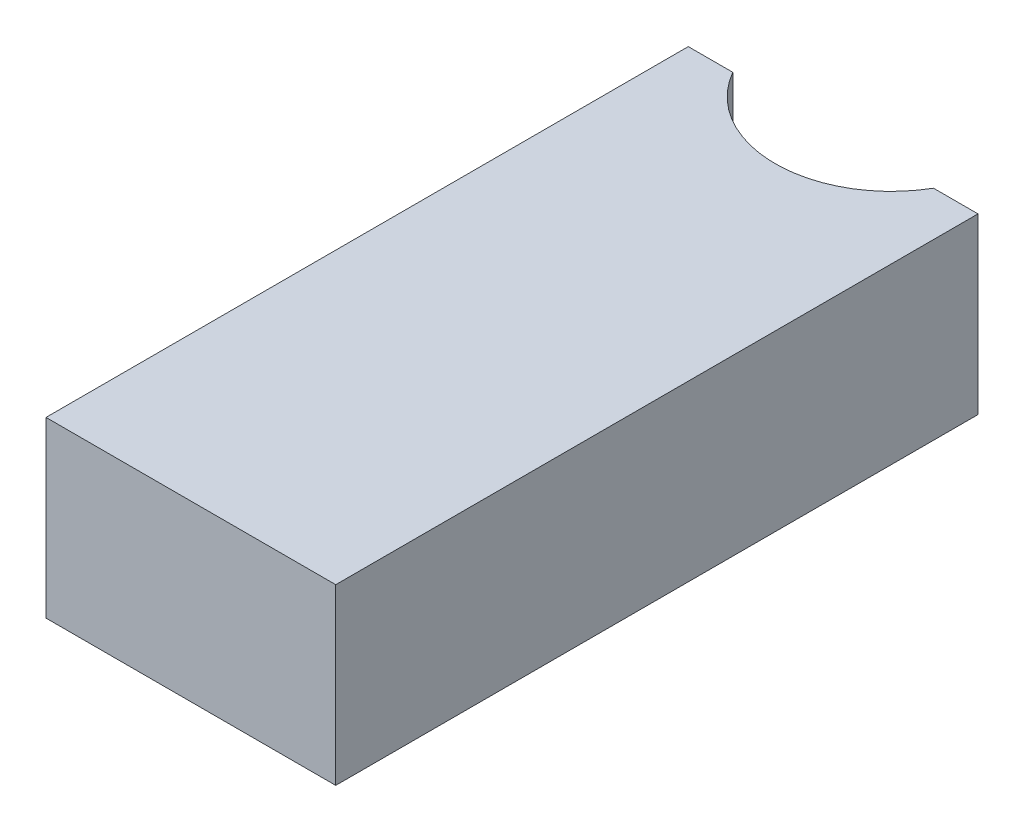
ISO-10303-21;
HEADER;
FILE_DESCRIPTION(('STEP AP214'),'2;1');
FILE_NAME('part.step','',(''),(''),'','','');
FILE_SCHEMA(('AUTOMOTIVE_DESIGN { 1 0 10303 214 1 1 1 1 }'));
ENDSEC;
DATA;
#1=APPLICATION_CONTEXT('core data for automotive mechanical design processes');
#2=APPLICATION_PROTOCOL_DEFINITION('international standard','automotive_design',2000,#1);
#3=PRODUCT_CONTEXT('',#1,'mechanical');
#4=PRODUCT('Part','Part','',(#3));
#5=PRODUCT_RELATED_PRODUCT_CATEGORY('part','',(#4));
#6=PRODUCT_DEFINITION_FORMATION('','',#4);
#7=PRODUCT_DEFINITION_CONTEXT('part definition',#1,'design');
#8=PRODUCT_DEFINITION('design','',#6,#7);
#9=PRODUCT_DEFINITION_SHAPE('','',#8);
#10=(LENGTH_UNIT() NAMED_UNIT(*) SI_UNIT(.MILLI.,.METRE.));
#11=(NAMED_UNIT(*) PLANE_ANGLE_UNIT() SI_UNIT($,.RADIAN.));
#12=(NAMED_UNIT(*) SI_UNIT($,.STERADIAN.) SOLID_ANGLE_UNIT());
#13=UNCERTAINTY_MEASURE_WITH_UNIT(LENGTH_MEASURE(1.E-05),#10,'distance_accuracy_value','');
#14=(GEOMETRIC_REPRESENTATION_CONTEXT(3) GLOBAL_UNCERTAINTY_ASSIGNED_CONTEXT((#13)) GLOBAL_UNIT_ASSIGNED_CONTEXT((#10,
#11,#12)) REPRESENTATION_CONTEXT('',''));
#15=CARTESIAN_POINT('',(0.,0.,0.));
#16=DIRECTION('',(0.,0.,1.));
#17=DIRECTION('',(1.,0.,0.));
#18=AXIS2_PLACEMENT_3D('',#15,#16,#17);
#19=CARTESIAN_POINT('',(0.,0.,0.));
#20=DIRECTION('',(0.,0.,1.));
#21=DIRECTION('',(1.,0.,0.));
#22=AXIS2_PLACEMENT_3D('',#19,#20,#21);
#23=PLANE('',#22);
#24=DIRECTION('',(1.,0.,0.));
#25=VECTOR('',#24,1.);
#26=CARTESIAN_POINT('',(-15.875,-9.525,0.));
#27=LINE('',#26,#25);
#28=CARTESIAN_POINT('',(10.9985226280624,-9.525,0.));
#29=VERTEX_POINT('',#28);
#30=CARTESIAN_POINT('',(15.875,-9.525,0.));
#31=VERTEX_POINT('',#30);
#32=EDGE_CURVE('E87',#29,#31,#27,.T.);
#33=ORIENTED_EDGE('',*,*,#32,.F.);
#34=DIRECTION('',(0.,1.,0.));
#35=VECTOR('',#34,1.);
#36=CARTESIAN_POINT('',(10.9985226280624,-9.525,0.));
#37=LINE('',#36,#35);
#38=CARTESIAN_POINT('',(10.9985226280624,9.525,0.));
#39=VERTEX_POINT('',#38);
#40=EDGE_CURVE('E11',#29,#39,#37,.T.);
#41=ORIENTED_EDGE('',*,*,#40,.T.);
#42=DIRECTION('',(-1.,0.,0.));
#43=VECTOR('',#42,1.);
#44=CARTESIAN_POINT('',(-15.875,9.525,0.));
#45=LINE('',#44,#43);
#46=CARTESIAN_POINT('',(15.875,9.525,0.));
#47=VERTEX_POINT('',#46);
#48=EDGE_CURVE('E110',#47,#39,#45,.T.);
#49=ORIENTED_EDGE('',*,*,#48,.F.);
#50=DIRECTION('',(0.,1.,0.));
#51=VECTOR('',#50,1.);
#52=CARTESIAN_POINT('',(15.875,9.525,0.));
#53=LINE('',#52,#51);
#54=EDGE_CURVE('E119',#31,#47,#53,.T.);
#55=ORIENTED_EDGE('',*,*,#54,.F.);
#56=EDGE_LOOP('',(#33,#41,#49,#55));
#57=FACE_BOUND('',#56,.T.);
#58=ADVANCED_FACE('F43',(#57),#23,.F.);
#59=CARTESIAN_POINT('',(15.875,9.525,70.3834));
#60=DIRECTION('',(-1.,0.,0.));
#61=DIRECTION('',(0.,0.,1.));
#62=AXIS2_PLACEMENT_3D('',#59,#60,#61);
#63=PLANE('',#62);
#64=ORIENTED_EDGE('',*,*,#54,.T.);
#65=DIRECTION('',(0.,0.,-1.));
#66=VECTOR('',#65,1.);
#67=CARTESIAN_POINT('',(15.875,9.525,70.3834));
#68=LINE('',#67,#66);
#69=CARTESIAN_POINT('',(15.875,9.525,70.3834));
#70=VERTEX_POINT('',#69);
#71=EDGE_CURVE('E113',#70,#47,#68,.T.);
#72=ORIENTED_EDGE('',*,*,#71,.F.);
#73=DIRECTION('',(0.,1.,0.));
#74=VECTOR('',#73,1.);
#75=CARTESIAN_POINT('',(15.875,9.525,70.3834));
#76=LINE('',#75,#74);
#77=CARTESIAN_POINT('',(15.875,-9.525,70.3834));
#78=VERTEX_POINT('',#77);
#79=EDGE_CURVE('E126',#78,#70,#76,.T.);
#80=ORIENTED_EDGE('',*,*,#79,.F.);
#81=DIRECTION('',(0.,0.,-1.));
#82=VECTOR('',#81,1.);
#83=CARTESIAN_POINT('',(15.875,-9.525,70.3834));
#84=LINE('',#83,#82);
#85=EDGE_CURVE('E127',#78,#31,#84,.T.);
#86=ORIENTED_EDGE('',*,*,#85,.T.);
#87=EDGE_LOOP('',(#64,#72,#80,#86));
#88=FACE_BOUND('',#87,.T.);
#89=ADVANCED_FACE('F45',(#88),#63,.F.);
#90=CARTESIAN_POINT('',(-15.875,9.525,70.3834));
#91=DIRECTION('',(0.,-1.,0.));
#92=DIRECTION('',(0.,0.,-1.));
#93=AXIS2_PLACEMENT_3D('',#90,#91,#92);
#94=PLANE('',#93);
#95=ORIENTED_EDGE('',*,*,#48,.T.);
#96=CARTESIAN_POINT('',(0.,9.525,-6.35));
#97=DIRECTION('',(0.,1.,0.));
#98=DIRECTION('',(0.,0.,1.));
#99=AXIS2_PLACEMENT_3D('',#96,#97,#98);
#100=CIRCLE('',#99,12.7);
#101=CARTESIAN_POINT('',(-10.9985226280624,9.525,0.));
#102=VERTEX_POINT('',#101);
#103=EDGE_CURVE('E103',#102,#39,#100,.T.);
#104=ORIENTED_EDGE('',*,*,#103,.F.);
#105=CARTESIAN_POINT('',(-15.875,9.525,0.));
#106=VERTEX_POINT('',#105);
#107=EDGE_CURVE('E116',#102,#106,#45,.T.);
#108=ORIENTED_EDGE('',*,*,#107,.T.);
#109=DIRECTION('',(0.,0.,-1.));
#110=VECTOR('',#109,1.);
#111=CARTESIAN_POINT('',(-15.875,9.525,70.3834));
#112=LINE('',#111,#110);
#113=CARTESIAN_POINT('',(-15.875,9.525,70.3834));
#114=VERTEX_POINT('',#113);
#115=EDGE_CURVE('E132',#114,#106,#112,.T.);
#116=ORIENTED_EDGE('',*,*,#115,.F.);
#117=DIRECTION('',(-1.,0.,0.));
#118=VECTOR('',#117,1.);
#119=CARTESIAN_POINT('',(-15.875,9.525,70.3834));
#120=LINE('',#119,#118);
#121=EDGE_CURVE('E95',#70,#114,#120,.T.);
#122=ORIENTED_EDGE('',*,*,#121,.F.);
#123=ORIENTED_EDGE('',*,*,#71,.T.);
#124=EDGE_LOOP('',(#95,#104,#108,#116,#122,#123));
#125=FACE_BOUND('',#124,.T.);
#126=ADVANCED_FACE('F111',(#125),#94,.F.);
#127=CARTESIAN_POINT('',(-15.875,9.525,70.3834));
#128=DIRECTION('',(1.,0.,0.));
#129=DIRECTION('',(0.,0.,-1.));
#130=AXIS2_PLACEMENT_3D('',#127,#128,#129);
#131=PLANE('',#130);
#132=DIRECTION('',(0.,-1.,0.));
#133=VECTOR('',#132,1.);
#134=CARTESIAN_POINT('',(-15.875,9.525,0.));
#135=LINE('',#134,#133);
#136=CARTESIAN_POINT('',(-15.875,-9.525,0.));
#137=VERTEX_POINT('',#136);
#138=EDGE_CURVE('E115',#106,#137,#135,.T.);
#139=ORIENTED_EDGE('',*,*,#138,.T.);
#140=DIRECTION('',(0.,0.,-1.));
#141=VECTOR('',#140,1.);
#142=CARTESIAN_POINT('',(-15.875,-9.525,70.3834));
#143=LINE('',#142,#141);
#144=CARTESIAN_POINT('',(-15.875,-9.525,70.3834));
#145=VERTEX_POINT('',#144);
#146=EDGE_CURVE('E129',#145,#137,#143,.T.);
#147=ORIENTED_EDGE('',*,*,#146,.F.);
#148=DIRECTION('',(0.,-1.,0.));
#149=VECTOR('',#148,1.);
#150=CARTESIAN_POINT('',(-15.875,9.525,70.3834));
#151=LINE('',#150,#149);
#152=EDGE_CURVE('E144',#114,#145,#151,.T.);
#153=ORIENTED_EDGE('',*,*,#152,.F.);
#154=ORIENTED_EDGE('',*,*,#115,.T.);
#155=EDGE_LOOP('',(#139,#147,#153,#154));
#156=FACE_BOUND('',#155,.T.);
#157=ADVANCED_FACE('F143',(#156),#131,.F.);
#158=CARTESIAN_POINT('',(-15.875,-9.525,70.3834));
#159=DIRECTION('',(0.,1.,0.));
#160=DIRECTION('',(0.,0.,1.));
#161=AXIS2_PLACEMENT_3D('',#158,#159,#160);
#162=PLANE('',#161);
#163=CARTESIAN_POINT('',(-10.9985226280624,-9.525,0.));
#164=VERTEX_POINT('',#163);
#165=EDGE_CURVE('E123',#137,#164,#27,.T.);
#166=ORIENTED_EDGE('',*,*,#165,.T.);
#167=CARTESIAN_POINT('',(0.,-9.525,-6.35));
#168=DIRECTION('',(0.,1.,0.));
#169=DIRECTION('',(0.,0.,1.));
#170=AXIS2_PLACEMENT_3D('',#167,#168,#169);
#171=CIRCLE('',#170,12.7);
#172=EDGE_CURVE('E58',#164,#29,#171,.T.);
#173=ORIENTED_EDGE('',*,*,#172,.T.);
#174=ORIENTED_EDGE('',*,*,#32,.T.);
#175=ORIENTED_EDGE('',*,*,#85,.F.);
#176=DIRECTION('',(1.,0.,0.));
#177=VECTOR('',#176,1.);
#178=CARTESIAN_POINT('',(-15.875,-9.525,70.3834));
#179=LINE('',#178,#177);
#180=EDGE_CURVE('E67',#145,#78,#179,.T.);
#181=ORIENTED_EDGE('',*,*,#180,.F.);
#182=ORIENTED_EDGE('',*,*,#146,.T.);
#183=EDGE_LOOP('',(#166,#173,#174,#175,#181,#182));
#184=FACE_BOUND('',#183,.T.);
#185=ADVANCED_FACE('F139',(#184),#162,.F.);
#186=CARTESIAN_POINT('',(0.,0.,70.3834));
#187=DIRECTION('',(0.,0.,1.));
#188=DIRECTION('',(1.,0.,0.));
#189=AXIS2_PLACEMENT_3D('',#186,#187,#188);
#190=PLANE('',#189);
#191=ORIENTED_EDGE('',*,*,#79,.T.);
#192=ORIENTED_EDGE('',*,*,#121,.T.);
#193=ORIENTED_EDGE('',*,*,#152,.T.);
#194=ORIENTED_EDGE('',*,*,#180,.T.);
#195=EDGE_LOOP('',(#191,#192,#193,#194));
#196=FACE_BOUND('',#195,.T.);
#197=ADVANCED_FACE('F151',(#196),#190,.T.);
#198=ORIENTED_EDGE('',*,*,#107,.F.);
#199=DIRECTION('',(0.,1.,0.));
#200=VECTOR('',#199,1.);
#201=CARTESIAN_POINT('',(-10.9985226280624,-9.525,0.));
#202=LINE('',#201,#200);
#203=EDGE_CURVE('E51',#102,#164,#202,.F.);
#204=ORIENTED_EDGE('',*,*,#203,.T.);
#205=ORIENTED_EDGE('',*,*,#165,.F.);
#206=ORIENTED_EDGE('',*,*,#138,.F.);
#207=EDGE_LOOP('',(#198,#204,#205,#206));
#208=FACE_BOUND('',#207,.T.);
#209=ADVANCED_FACE('F137',(#208),#23,.F.);
#210=CARTESIAN_POINT('',(0.,-9.525,-6.35));
#211=DIRECTION('',(0.,1.,0.));
#212=DIRECTION('',(0.,0.,1.));
#213=AXIS2_PLACEMENT_3D('',#210,#211,#212);
#214=CYLINDRICAL_SURFACE('',#213,12.7);
#215=ORIENTED_EDGE('',*,*,#172,.F.);
#216=ORIENTED_EDGE('',*,*,#203,.F.);
#217=ORIENTED_EDGE('',*,*,#103,.T.);
#218=ORIENTED_EDGE('',*,*,#40,.F.);
#219=EDGE_LOOP('',(#215,#216,#217,#218));
#220=FACE_BOUND('',#219,.T.);
#221=ADVANCED_FACE('F104',(#220),#214,.F.);
#222=CLOSED_SHELL('',(#58,#89,#126,#157,#185,#197,#209,#221));
#223=MANIFOLD_SOLID_BREP('B2',#222);
#224=ADVANCED_BREP_SHAPE_REPRESENTATION('',(#18,#223),#14);
#225=SHAPE_DEFINITION_REPRESENTATION(#9,#224);
ENDSEC;
END-ISO-10303-21;
